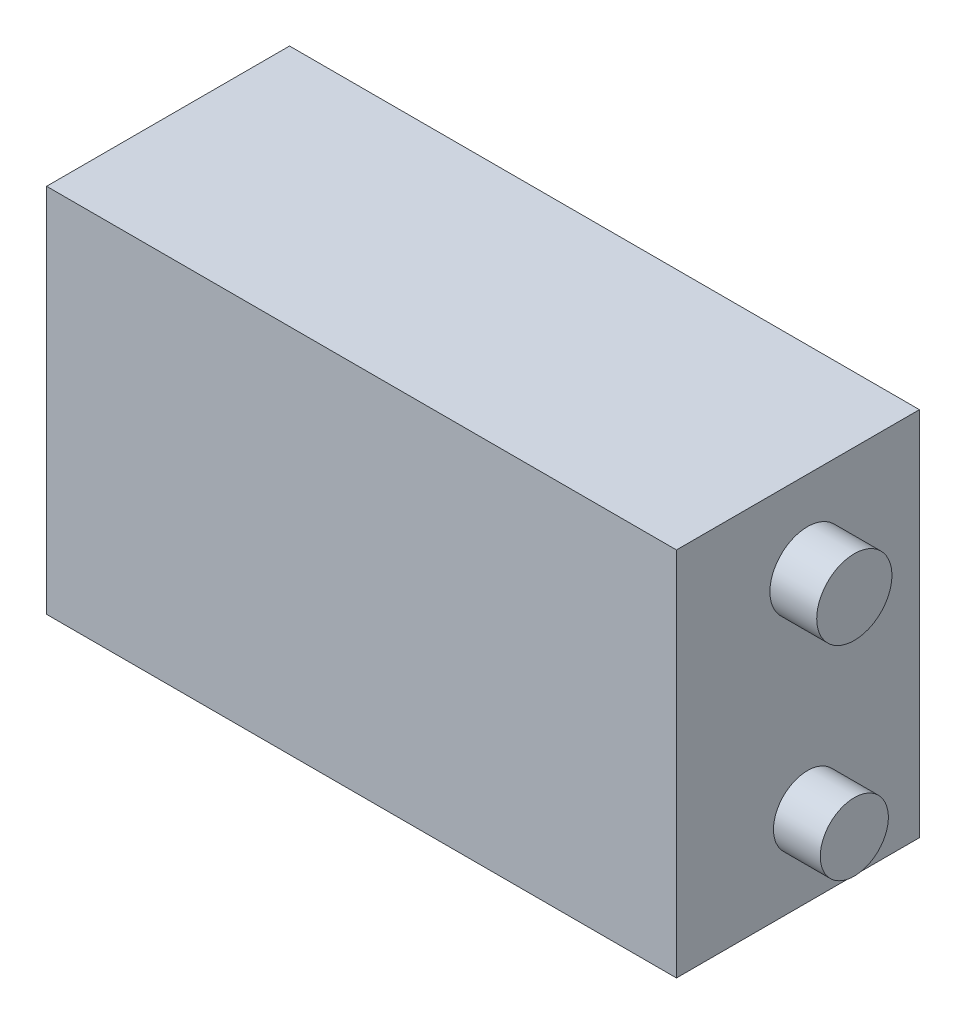
ISO-10303-21;
HEADER;
FILE_DESCRIPTION(('STEP AP214'),'2;1');
FILE_NAME('part.step','',(''),(''),'','','');
FILE_SCHEMA(('AUTOMOTIVE_DESIGN { 1 0 10303 214 1 1 1 1 }'));
ENDSEC;
DATA;
#1=APPLICATION_CONTEXT('core data for automotive mechanical design processes');
#2=APPLICATION_PROTOCOL_DEFINITION('international standard','automotive_design',2000,#1);
#3=PRODUCT_CONTEXT('',#1,'mechanical');
#4=PRODUCT('Part','Part','',(#3));
#5=PRODUCT_RELATED_PRODUCT_CATEGORY('part','',(#4));
#6=PRODUCT_DEFINITION_FORMATION('','',#4);
#7=PRODUCT_DEFINITION_CONTEXT('part definition',#1,'design');
#8=PRODUCT_DEFINITION('design','',#6,#7);
#9=PRODUCT_DEFINITION_SHAPE('','',#8);
#10=(LENGTH_UNIT() NAMED_UNIT(*) SI_UNIT(.MILLI.,.METRE.));
#11=(NAMED_UNIT(*) PLANE_ANGLE_UNIT() SI_UNIT($,.RADIAN.));
#12=(NAMED_UNIT(*) SI_UNIT($,.STERADIAN.) SOLID_ANGLE_UNIT());
#13=UNCERTAINTY_MEASURE_WITH_UNIT(LENGTH_MEASURE(1.E-05),#10,'distance_accuracy_value','');
#14=(GEOMETRIC_REPRESENTATION_CONTEXT(3) GLOBAL_UNCERTAINTY_ASSIGNED_CONTEXT((#13)) GLOBAL_UNIT_ASSIGNED_CONTEXT((#10,
#11,#12)) REPRESENTATION_CONTEXT('',''));
#15=CARTESIAN_POINT('',(0.,0.,0.));
#16=DIRECTION('',(0.,0.,1.));
#17=DIRECTION('',(1.,0.,0.));
#18=AXIS2_PLACEMENT_3D('',#15,#16,#17);
#19=CARTESIAN_POINT('',(22.225,-13.081,17.145));
#20=DIRECTION('',(-1.,0.,0.));
#21=DIRECTION('',(0.,0.,1.));
#22=AXIS2_PLACEMENT_3D('',#19,#20,#21);
#23=PLANE('',#22);
#24=CARTESIAN_POINT('',(22.225,7.2270346236758,7.89684855686801));
#25=DIRECTION('',(-1.,0.,0.));
#26=DIRECTION('',(0.,0.,1.));
#27=AXIS2_PLACEMENT_3D('',#24,#25,#26);
#28=CIRCLE('',#27,2.65301325762193);
#29=CARTESIAN_POINT('',(22.225,7.2270346236758,10.5498618144899));
#30=VERTEX_POINT('',#29);
#31=EDGE_CURVE('E41',#30,#30,#28,.F.);
#32=ORIENTED_EDGE('',*,*,#31,.F.);
#33=EDGE_LOOP('',(#32));
#34=FACE_BOUND('',#33,.T.);
#35=DIRECTION('',(0.,1.,0.));
#36=VECTOR('',#35,1.);
#37=CARTESIAN_POINT('',(22.225,-13.081,0.));
#38=LINE('',#37,#36);
#39=CARTESIAN_POINT('',(22.225,-13.081,0.));
#40=VERTEX_POINT('',#39);
#41=CARTESIAN_POINT('',(22.225,13.081,0.));
#42=VERTEX_POINT('',#41);
#43=EDGE_CURVE('E100',#40,#42,#38,.T.);
#44=ORIENTED_EDGE('',*,*,#43,.T.);
#45=DIRECTION('',(0.,0.,-1.));
#46=VECTOR('',#45,1.);
#47=CARTESIAN_POINT('',(22.225,13.081,17.145));
#48=LINE('',#47,#46);
#49=CARTESIAN_POINT('',(22.225,13.081,17.145));
#50=VERTEX_POINT('',#49);
#51=EDGE_CURVE('E91',#50,#42,#48,.T.);
#52=ORIENTED_EDGE('',*,*,#51,.F.);
#53=DIRECTION('',(0.,1.,0.));
#54=VECTOR('',#53,1.);
#55=CARTESIAN_POINT('',(22.225,-13.081,17.145));
#56=LINE('',#55,#54);
#57=CARTESIAN_POINT('',(22.225,-13.081,17.145));
#58=VERTEX_POINT('',#57);
#59=EDGE_CURVE('E85',#58,#50,#56,.T.);
#60=ORIENTED_EDGE('',*,*,#59,.F.);
#61=DIRECTION('',(0.,0.,-1.));
#62=VECTOR('',#61,1.);
#63=CARTESIAN_POINT('',(22.225,-13.081,17.145));
#64=LINE('',#63,#62);
#65=EDGE_CURVE('E96',#58,#40,#64,.T.);
#66=ORIENTED_EDGE('',*,*,#65,.T.);
#67=EDGE_LOOP('',(#44,#52,#60,#66));
#68=FACE_BOUND('',#67,.T.);
#69=CARTESIAN_POINT('',(22.225,-7.42883629189883,7.89684855686801));
#70=DIRECTION('',(-1.,0.,0.));
#71=DIRECTION('',(0.,0.,1.));
#72=AXIS2_PLACEMENT_3D('',#69,#70,#71);
#73=CIRCLE('',#72,2.4014102299792);
#74=CARTESIAN_POINT('',(22.225,-7.42883629189883,10.2982587868472));
#75=VERTEX_POINT('',#74);
#76=EDGE_CURVE('E11',#75,#75,#73,.F.);
#77=ORIENTED_EDGE('',*,*,#76,.F.);
#78=EDGE_LOOP('',(#77));
#79=FACE_BOUND('',#78,.T.);
#80=ADVANCED_FACE('F33',(#34,#68,#79),#23,.F.);
#81=CARTESIAN_POINT('',(-22.225,13.081,17.145));
#82=DIRECTION('',(0.,-1.,0.));
#83=DIRECTION('',(0.,0.,-1.));
#84=AXIS2_PLACEMENT_3D('',#81,#82,#83);
#85=PLANE('',#84);
#86=DIRECTION('',(-1.,0.,0.));
#87=VECTOR('',#86,1.);
#88=CARTESIAN_POINT('',(-22.225,13.081,0.));
#89=LINE('',#88,#87);
#90=CARTESIAN_POINT('',(-22.225,13.081,0.));
#91=VERTEX_POINT('',#90);
#92=EDGE_CURVE('E90',#42,#91,#89,.T.);
#93=ORIENTED_EDGE('',*,*,#92,.T.);
#94=DIRECTION('',(0.,0.,-1.));
#95=VECTOR('',#94,1.);
#96=CARTESIAN_POINT('',(-22.225,13.081,17.145));
#97=LINE('',#96,#95);
#98=CARTESIAN_POINT('',(-22.225,13.081,17.145));
#99=VERTEX_POINT('',#98);
#100=EDGE_CURVE('E88',#99,#91,#97,.T.);
#101=ORIENTED_EDGE('',*,*,#100,.F.);
#102=DIRECTION('',(-1.,0.,0.));
#103=VECTOR('',#102,1.);
#104=CARTESIAN_POINT('',(-22.225,13.081,17.145));
#105=LINE('',#104,#103);
#106=EDGE_CURVE('E80',#50,#99,#105,.T.);
#107=ORIENTED_EDGE('',*,*,#106,.F.);
#108=ORIENTED_EDGE('',*,*,#51,.T.);
#109=EDGE_LOOP('',(#93,#101,#107,#108));
#110=FACE_BOUND('',#109,.T.);
#111=ADVANCED_FACE('F89',(#110),#85,.F.);
#112=CARTESIAN_POINT('',(-22.225,-13.081,17.145));
#113=DIRECTION('',(1.,0.,0.));
#114=DIRECTION('',(0.,0.,-1.));
#115=AXIS2_PLACEMENT_3D('',#112,#113,#114);
#116=PLANE('',#115);
#117=DIRECTION('',(0.,-1.,0.));
#118=VECTOR('',#117,1.);
#119=CARTESIAN_POINT('',(-22.225,-13.081,0.));
#120=LINE('',#119,#118);
#121=CARTESIAN_POINT('',(-22.225,-13.081,0.));
#122=VERTEX_POINT('',#121);
#123=EDGE_CURVE('E66',#91,#122,#120,.T.);
#124=ORIENTED_EDGE('',*,*,#123,.T.);
#125=DIRECTION('',(0.,0.,-1.));
#126=VECTOR('',#125,1.);
#127=CARTESIAN_POINT('',(-22.225,-13.081,17.145));
#128=LINE('',#127,#126);
#129=CARTESIAN_POINT('',(-22.225,-13.081,17.145));
#130=VERTEX_POINT('',#129);
#131=EDGE_CURVE('E92',#130,#122,#128,.T.);
#132=ORIENTED_EDGE('',*,*,#131,.F.);
#133=DIRECTION('',(0.,-1.,0.));
#134=VECTOR('',#133,1.);
#135=CARTESIAN_POINT('',(-22.225,-13.081,17.145));
#136=LINE('',#135,#134);
#137=EDGE_CURVE('E83',#99,#130,#136,.T.);
#138=ORIENTED_EDGE('',*,*,#137,.F.);
#139=ORIENTED_EDGE('',*,*,#100,.T.);
#140=EDGE_LOOP('',(#124,#132,#138,#139));
#141=FACE_BOUND('',#140,.T.);
#142=ADVANCED_FACE('F94',(#141),#116,.F.);
#143=CARTESIAN_POINT('',(-22.225,-13.081,17.145));
#144=DIRECTION('',(0.,1.,0.));
#145=DIRECTION('',(0.,0.,1.));
#146=AXIS2_PLACEMENT_3D('',#143,#144,#145);
#147=PLANE('',#146);
#148=DIRECTION('',(1.,0.,0.));
#149=VECTOR('',#148,1.);
#150=CARTESIAN_POINT('',(-22.225,-13.081,0.));
#151=LINE('',#150,#149);
#152=EDGE_CURVE('E72',#122,#40,#151,.T.);
#153=ORIENTED_EDGE('',*,*,#152,.T.);
#154=ORIENTED_EDGE('',*,*,#65,.F.);
#155=DIRECTION('',(1.,0.,0.));
#156=VECTOR('',#155,1.);
#157=CARTESIAN_POINT('',(-22.225,-13.081,17.145));
#158=LINE('',#157,#156);
#159=EDGE_CURVE('E49',#130,#58,#158,.T.);
#160=ORIENTED_EDGE('',*,*,#159,.F.);
#161=ORIENTED_EDGE('',*,*,#131,.T.);
#162=EDGE_LOOP('',(#153,#154,#160,#161));
#163=FACE_BOUND('',#162,.T.);
#164=ADVANCED_FACE('F142',(#163),#147,.F.);
#165=CARTESIAN_POINT('',(0.,0.,17.145));
#166=DIRECTION('',(0.,0.,-1.));
#167=DIRECTION('',(-1.,0.,0.));
#168=AXIS2_PLACEMENT_3D('',#165,#166,#167);
#169=PLANE('',#168);
#170=ORIENTED_EDGE('',*,*,#59,.T.);
#171=ORIENTED_EDGE('',*,*,#106,.T.);
#172=ORIENTED_EDGE('',*,*,#137,.T.);
#173=ORIENTED_EDGE('',*,*,#159,.T.);
#174=EDGE_LOOP('',(#170,#171,#172,#173));
#175=FACE_BOUND('',#174,.T.);
#176=ADVANCED_FACE('F81',(#175),#169,.F.);
#177=CARTESIAN_POINT('',(0.,0.,0.));
#178=DIRECTION('',(0.,0.,-1.));
#179=DIRECTION('',(-1.,0.,0.));
#180=AXIS2_PLACEMENT_3D('',#177,#178,#179);
#181=PLANE('',#180);
#182=ORIENTED_EDGE('',*,*,#43,.F.);
#183=ORIENTED_EDGE('',*,*,#152,.F.);
#184=ORIENTED_EDGE('',*,*,#123,.F.);
#185=ORIENTED_EDGE('',*,*,#92,.F.);
#186=EDGE_LOOP('',(#182,#183,#184,#185));
#187=FACE_BOUND('',#186,.T.);
#188=ADVANCED_FACE('F138',(#187),#181,.T.);
#189=CARTESIAN_POINT('',(25.527,7.2270346236758,7.89684855686801));
#190=DIRECTION('',(-1.,0.,0.));
#191=DIRECTION('',(0.,0.,1.));
#192=AXIS2_PLACEMENT_3D('',#189,#190,#191);
#193=CYLINDRICAL_SURFACE('',#192,2.65301325762193);
#194=CARTESIAN_POINT('',(25.527,7.2270346236758,7.89684855686801));
#195=DIRECTION('',(1.,0.,0.));
#196=DIRECTION('',(0.,0.,-1.));
#197=AXIS2_PLACEMENT_3D('',#194,#195,#196);
#198=CIRCLE('',#197,2.65301325762193);
#199=CARTESIAN_POINT('',(25.527,7.2270346236758,10.5498618144899));
#200=VERTEX_POINT('',#199);
#201=EDGE_CURVE('E103',#200,#200,#198,.T.);
#202=CARTESIAN_POINT('',(25.527,7.2270346236758,10.5498618144899));
#203=CARTESIAN_POINT('',(25.4926041666667,7.2270346236758,10.5498618144899));
#204=CARTESIAN_POINT('',(25.4582083333333,7.2270346236758,10.5498618144899));
#205=CARTESIAN_POINT('',(25.3894166666667,7.2270346236758,10.5498618144899));
#206=CARTESIAN_POINT('',(25.3550208333333,7.2270346236758,10.5498618144899));
#207=CARTESIAN_POINT('',(25.2862291666667,7.2270346236758,10.5498618144899));
#208=CARTESIAN_POINT('',(25.2518333333333,7.2270346236758,10.5498618144899));
#209=CARTESIAN_POINT('',(25.1830416666667,7.2270346236758,10.5498618144899));
#210=CARTESIAN_POINT('',(25.1486458333333,7.2270346236758,10.5498618144899));
#211=CARTESIAN_POINT('',(25.0798541666667,7.2270346236758,10.5498618144899));
#212=CARTESIAN_POINT('',(25.0454583333333,7.2270346236758,10.5498618144899));
#213=CARTESIAN_POINT('',(24.9766666666667,7.2270346236758,10.5498618144899));
#214=CARTESIAN_POINT('',(24.9422708333333,7.2270346236758,10.5498618144899));
#215=CARTESIAN_POINT('',(24.8734791666667,7.2270346236758,10.5498618144899));
#216=CARTESIAN_POINT('',(24.8390833333333,7.2270346236758,10.5498618144899));
#217=CARTESIAN_POINT('',(24.7702916666667,7.2270346236758,10.5498618144899));
#218=CARTESIAN_POINT('',(24.7358958333333,7.2270346236758,10.5498618144899));
#219=CARTESIAN_POINT('',(24.6671041666667,7.2270346236758,10.5498618144899));
#220=CARTESIAN_POINT('',(24.6327083333333,7.2270346236758,10.5498618144899));
#221=CARTESIAN_POINT('',(24.5639166666667,7.2270346236758,10.5498618144899));
#222=CARTESIAN_POINT('',(24.5295208333333,7.2270346236758,10.5498618144899));
#223=CARTESIAN_POINT('',(24.4607291666667,7.2270346236758,10.5498618144899));
#224=CARTESIAN_POINT('',(24.4263333333333,7.2270346236758,10.5498618144899));
#225=CARTESIAN_POINT('',(24.3575416666667,7.2270346236758,10.5498618144899));
#226=CARTESIAN_POINT('',(24.3231458333333,7.2270346236758,10.5498618144899));
#227=CARTESIAN_POINT('',(24.2543541666667,7.2270346236758,10.5498618144899));
#228=CARTESIAN_POINT('',(24.2199583333333,7.2270346236758,10.5498618144899));
#229=CARTESIAN_POINT('',(24.1511666666667,7.2270346236758,10.5498618144899));
#230=CARTESIAN_POINT('',(24.1167708333333,7.2270346236758,10.5498618144899));
#231=CARTESIAN_POINT('',(24.0479791666667,7.2270346236758,10.5498618144899));
#232=CARTESIAN_POINT('',(24.0135833333333,7.2270346236758,10.5498618144899));
#233=CARTESIAN_POINT('',(23.9447916666667,7.2270346236758,10.5498618144899));
#234=CARTESIAN_POINT('',(23.9103958333333,7.2270346236758,10.5498618144899));
#235=CARTESIAN_POINT('',(23.8416041666667,7.2270346236758,10.5498618144899));
#236=CARTESIAN_POINT('',(23.8072083333333,7.2270346236758,10.5498618144899));
#237=CARTESIAN_POINT('',(23.7384166666667,7.2270346236758,10.5498618144899));
#238=CARTESIAN_POINT('',(23.7040208333333,7.2270346236758,10.5498618144899));
#239=CARTESIAN_POINT('',(23.6352291666667,7.2270346236758,10.5498618144899));
#240=CARTESIAN_POINT('',(23.6008333333333,7.2270346236758,10.5498618144899));
#241=CARTESIAN_POINT('',(23.5320416666667,7.2270346236758,10.5498618144899));
#242=CARTESIAN_POINT('',(23.4976458333333,7.2270346236758,10.5498618144899));
#243=CARTESIAN_POINT('',(23.4288541666667,7.2270346236758,10.5498618144899));
#244=CARTESIAN_POINT('',(23.3944583333333,7.2270346236758,10.5498618144899));
#245=CARTESIAN_POINT('',(23.3256666666667,7.2270346236758,10.5498618144899));
#246=CARTESIAN_POINT('',(23.2912708333333,7.2270346236758,10.5498618144899));
#247=CARTESIAN_POINT('',(23.2224791666667,7.2270346236758,10.5498618144899));
#248=CARTESIAN_POINT('',(23.1880833333333,7.2270346236758,10.5498618144899));
#249=CARTESIAN_POINT('',(23.1192916666667,7.2270346236758,10.5498618144899));
#250=CARTESIAN_POINT('',(23.0848958333333,7.2270346236758,10.5498618144899));
#251=CARTESIAN_POINT('',(23.0161041666667,7.2270346236758,10.5498618144899));
#252=CARTESIAN_POINT('',(22.9817083333333,7.2270346236758,10.5498618144899));
#253=CARTESIAN_POINT('',(22.9129166666667,7.2270346236758,10.5498618144899));
#254=CARTESIAN_POINT('',(22.8785208333333,7.2270346236758,10.5498618144899));
#255=CARTESIAN_POINT('',(22.8097291666667,7.2270346236758,10.5498618144899));
#256=CARTESIAN_POINT('',(22.7753333333333,7.2270346236758,10.5498618144899));
#257=CARTESIAN_POINT('',(22.7065416666667,7.2270346236758,10.5498618144899));
#258=CARTESIAN_POINT('',(22.6721458333333,7.2270346236758,10.5498618144899));
#259=CARTESIAN_POINT('',(22.6033541666667,7.2270346236758,10.5498618144899));
#260=CARTESIAN_POINT('',(22.5689583333333,7.2270346236758,10.5498618144899));
#261=CARTESIAN_POINT('',(22.5001666666667,7.2270346236758,10.5498618144899));
#262=CARTESIAN_POINT('',(22.4657708333333,7.2270346236758,10.5498618144899));
#263=CARTESIAN_POINT('',(22.3969791666667,7.2270346236758,10.5498618144899));
#264=CARTESIAN_POINT('',(22.3625833333333,7.2270346236758,10.5498618144899));
#265=CARTESIAN_POINT('',(22.2937916666667,7.2270346236758,10.5498618144899));
#266=CARTESIAN_POINT('',(22.2593958333333,7.2270346236758,10.5498618144899));
#267=CARTESIAN_POINT('',(22.225,7.2270346236758,10.5498618144899));
#268=B_SPLINE_CURVE_WITH_KNOTS('',3,(#202,#203,#204,#205,#206,#207,#208,#209,#210,#211,#212,
#213,#214,#215,#216,#217,#218,#219,#220,#221,#222,#223,#224,#225,#226,#227,#228,#229,#230,#231,
#232,#233,#234,#235,#236,#237,#238,#239,#240,#241,#242,#243,#244,#245,#246,#247,#248,#249,#250,
#251,#252,#253,#254,#255,#256,#257,#258,#259,#260,#261,#262,#263,#264,#265,#266,#267),
.UNSPECIFIED.,.F.,.F.,(4,2,2,2,2,2,2,2,2,2,2,2,2,2,2,2,2,2,2,2,2,2,2,2,2,2,2,2,2,2,2,2,4),(0.,
0.103187500000001,0.206375000000002,0.309562500000003,0.41275,0.515937500000001,
0.619125000000002,0.722312500000002,0.8255,0.928687500000001,1.031875,1.1350625,1.23825,
1.3414375,1.444625,1.5478125,1.651,1.7541875,1.857375,1.9605625,2.06375,2.1669375,2.270125,
2.3733125,2.4765,2.5796875,2.682875,2.7860625,2.88925,2.9924375,3.095625,3.1988125,3.302),.UNSPECIFIED.);
#269=EDGE_CURVE('BSEAM112',#200,#30,#268,.T.);
#270=ORIENTED_EDGE('',*,*,#201,.F.);
#271=ORIENTED_EDGE('',*,*,#31,.T.);
#272=ORIENTED_EDGE('',*,*,#269,.T.);
#273=ORIENTED_EDGE('',*,*,#269,.F.);
#274=EDGE_LOOP('',(#270,#272,#271,#273));
#275=FACE_BOUND('',#274,.T.);
#276=ADVANCED_FACE('F112',(#275),#193,.T.);
#277=CARTESIAN_POINT('',(25.527,7.2270346236758,7.89684855686801));
#278=DIRECTION('',(1.,0.,0.));
#279=DIRECTION('',(0.,0.,-1.));
#280=AXIS2_PLACEMENT_3D('',#277,#278,#279);
#281=PLANE('',#280);
#282=ORIENTED_EDGE('',*,*,#201,.T.);
#283=EDGE_LOOP('',(#282));
#284=FACE_BOUND('',#283,.T.);
#285=ADVANCED_FACE('F123',(#284),#281,.T.);
#286=CARTESIAN_POINT('',(25.527,-7.42883629189883,7.89684855686801));
#287=DIRECTION('',(-1.,0.,0.));
#288=DIRECTION('',(0.,0.,1.));
#289=AXIS2_PLACEMENT_3D('',#286,#287,#288);
#290=CYLINDRICAL_SURFACE('',#289,2.4014102299792);
#291=CARTESIAN_POINT('',(25.527,-7.42883629189883,7.89684855686801));
#292=DIRECTION('',(1.,0.,0.));
#293=DIRECTION('',(0.,0.,-1.));
#294=AXIS2_PLACEMENT_3D('',#291,#292,#293);
#295=CIRCLE('',#294,2.4014102299792);
#296=CARTESIAN_POINT('',(25.527,-7.42883629189883,10.2982587868472));
#297=VERTEX_POINT('',#296);
#298=EDGE_CURVE('E211',#297,#297,#295,.T.);
#299=CARTESIAN_POINT('',(25.527,-7.42883629189883,10.2982587868472));
#300=CARTESIAN_POINT('',(25.4926041666667,-7.42883629189883,10.2982587868472));
#301=CARTESIAN_POINT('',(25.4582083333333,-7.42883629189883,10.2982587868472));
#302=CARTESIAN_POINT('',(25.3894166666667,-7.42883629189883,10.2982587868472));
#303=CARTESIAN_POINT('',(25.3550208333333,-7.42883629189883,10.2982587868472));
#304=CARTESIAN_POINT('',(25.2862291666667,-7.42883629189883,10.2982587868472));
#305=CARTESIAN_POINT('',(25.2518333333333,-7.42883629189883,10.2982587868472));
#306=CARTESIAN_POINT('',(25.1830416666667,-7.42883629189883,10.2982587868472));
#307=CARTESIAN_POINT('',(25.1486458333333,-7.42883629189883,10.2982587868472));
#308=CARTESIAN_POINT('',(25.0798541666667,-7.42883629189883,10.2982587868472));
#309=CARTESIAN_POINT('',(25.0454583333333,-7.42883629189883,10.2982587868472));
#310=CARTESIAN_POINT('',(24.9766666666667,-7.42883629189883,10.2982587868472));
#311=CARTESIAN_POINT('',(24.9422708333333,-7.42883629189883,10.2982587868472));
#312=CARTESIAN_POINT('',(24.8734791666667,-7.42883629189883,10.2982587868472));
#313=CARTESIAN_POINT('',(24.8390833333333,-7.42883629189883,10.2982587868472));
#314=CARTESIAN_POINT('',(24.7702916666667,-7.42883629189883,10.2982587868472));
#315=CARTESIAN_POINT('',(24.7358958333333,-7.42883629189883,10.2982587868472));
#316=CARTESIAN_POINT('',(24.6671041666667,-7.42883629189883,10.2982587868472));
#317=CARTESIAN_POINT('',(24.6327083333333,-7.42883629189883,10.2982587868472));
#318=CARTESIAN_POINT('',(24.5639166666667,-7.42883629189883,10.2982587868472));
#319=CARTESIAN_POINT('',(24.5295208333333,-7.42883629189883,10.2982587868472));
#320=CARTESIAN_POINT('',(24.4607291666667,-7.42883629189883,10.2982587868472));
#321=CARTESIAN_POINT('',(24.4263333333333,-7.42883629189883,10.2982587868472));
#322=CARTESIAN_POINT('',(24.3575416666667,-7.42883629189883,10.2982587868472));
#323=CARTESIAN_POINT('',(24.3231458333333,-7.42883629189883,10.2982587868472));
#324=CARTESIAN_POINT('',(24.2543541666667,-7.42883629189883,10.2982587868472));
#325=CARTESIAN_POINT('',(24.2199583333333,-7.42883629189883,10.2982587868472));
#326=CARTESIAN_POINT('',(24.1511666666667,-7.42883629189883,10.2982587868472));
#327=CARTESIAN_POINT('',(24.1167708333333,-7.42883629189883,10.2982587868472));
#328=CARTESIAN_POINT('',(24.0479791666667,-7.42883629189883,10.2982587868472));
#329=CARTESIAN_POINT('',(24.0135833333333,-7.42883629189883,10.2982587868472));
#330=CARTESIAN_POINT('',(23.9447916666667,-7.42883629189883,10.2982587868472));
#331=CARTESIAN_POINT('',(23.9103958333333,-7.42883629189883,10.2982587868472));
#332=CARTESIAN_POINT('',(23.8416041666667,-7.42883629189883,10.2982587868472));
#333=CARTESIAN_POINT('',(23.8072083333333,-7.42883629189883,10.2982587868472));
#334=CARTESIAN_POINT('',(23.7384166666667,-7.42883629189883,10.2982587868472));
#335=CARTESIAN_POINT('',(23.7040208333333,-7.42883629189883,10.2982587868472));
#336=CARTESIAN_POINT('',(23.6352291666667,-7.42883629189883,10.2982587868472));
#337=CARTESIAN_POINT('',(23.6008333333333,-7.42883629189883,10.2982587868472));
#338=CARTESIAN_POINT('',(23.5320416666667,-7.42883629189883,10.2982587868472));
#339=CARTESIAN_POINT('',(23.4976458333333,-7.42883629189883,10.2982587868472));
#340=CARTESIAN_POINT('',(23.4288541666667,-7.42883629189883,10.2982587868472));
#341=CARTESIAN_POINT('',(23.3944583333333,-7.42883629189883,10.2982587868472));
#342=CARTESIAN_POINT('',(23.3256666666667,-7.42883629189883,10.2982587868472));
#343=CARTESIAN_POINT('',(23.2912708333333,-7.42883629189883,10.2982587868472));
#344=CARTESIAN_POINT('',(23.2224791666667,-7.42883629189883,10.2982587868472));
#345=CARTESIAN_POINT('',(23.1880833333333,-7.42883629189883,10.2982587868472));
#346=CARTESIAN_POINT('',(23.1192916666667,-7.42883629189883,10.2982587868472));
#347=CARTESIAN_POINT('',(23.0848958333333,-7.42883629189883,10.2982587868472));
#348=CARTESIAN_POINT('',(23.0161041666667,-7.42883629189883,10.2982587868472));
#349=CARTESIAN_POINT('',(22.9817083333333,-7.42883629189883,10.2982587868472));
#350=CARTESIAN_POINT('',(22.9129166666667,-7.42883629189883,10.2982587868472));
#351=CARTESIAN_POINT('',(22.8785208333333,-7.42883629189883,10.2982587868472));
#352=CARTESIAN_POINT('',(22.8097291666667,-7.42883629189883,10.2982587868472));
#353=CARTESIAN_POINT('',(22.7753333333333,-7.42883629189883,10.2982587868472));
#354=CARTESIAN_POINT('',(22.7065416666667,-7.42883629189883,10.2982587868472));
#355=CARTESIAN_POINT('',(22.6721458333333,-7.42883629189883,10.2982587868472));
#356=CARTESIAN_POINT('',(22.6033541666667,-7.42883629189883,10.2982587868472));
#357=CARTESIAN_POINT('',(22.5689583333333,-7.42883629189883,10.2982587868472));
#358=CARTESIAN_POINT('',(22.5001666666667,-7.42883629189883,10.2982587868472));
#359=CARTESIAN_POINT('',(22.4657708333333,-7.42883629189883,10.2982587868472));
#360=CARTESIAN_POINT('',(22.3969791666667,-7.42883629189883,10.2982587868472));
#361=CARTESIAN_POINT('',(22.3625833333333,-7.42883629189883,10.2982587868472));
#362=CARTESIAN_POINT('',(22.2937916666667,-7.42883629189883,10.2982587868472));
#363=CARTESIAN_POINT('',(22.2593958333333,-7.42883629189883,10.2982587868472));
#364=CARTESIAN_POINT('',(22.225,-7.42883629189883,10.2982587868472));
#365=B_SPLINE_CURVE_WITH_KNOTS('',3,(#299,#300,#301,#302,#303,#304,#305,#306,#307,#308,#309,
#310,#311,#312,#313,#314,#315,#316,#317,#318,#319,#320,#321,#322,#323,#324,#325,#326,#327,#328,
#329,#330,#331,#332,#333,#334,#335,#336,#337,#338,#339,#340,#341,#342,#343,#344,#345,#346,#347,
#348,#349,#350,#351,#352,#353,#354,#355,#356,#357,#358,#359,#360,#361,#362,#363,#364),
.UNSPECIFIED.,.F.,.F.,(4,2,2,2,2,2,2,2,2,2,2,2,2,2,2,2,2,2,2,2,2,2,2,2,2,2,2,2,2,2,2,2,4),(0.,
0.103187500000001,0.206375000000002,0.309562500000003,0.41275,0.515937500000001,
0.619125000000002,0.722312500000002,0.8255,0.928687500000001,1.031875,1.1350625,1.23825,
1.3414375,1.444625,1.5478125,1.651,1.7541875,1.857375,1.9605625,2.06375,2.1669375,2.270125,
2.3733125,2.4765,2.5796875,2.682875,2.7860625,2.88925,2.9924375,3.095625,3.1988125,3.302),.UNSPECIFIED.);
#366=EDGE_CURVE('BSEAM120',#297,#75,#365,.T.);
#367=ORIENTED_EDGE('',*,*,#298,.F.);
#368=ORIENTED_EDGE('',*,*,#76,.T.);
#369=ORIENTED_EDGE('',*,*,#366,.T.);
#370=ORIENTED_EDGE('',*,*,#366,.F.);
#371=EDGE_LOOP('',(#367,#369,#368,#370));
#372=FACE_BOUND('',#371,.T.);
#373=ADVANCED_FACE('F120',(#372),#290,.T.);
#374=CARTESIAN_POINT('',(25.527,-7.42883629189883,7.89684855686801));
#375=DIRECTION('',(1.,0.,0.));
#376=DIRECTION('',(0.,0.,-1.));
#377=AXIS2_PLACEMENT_3D('',#374,#375,#376);
#378=PLANE('',#377);
#379=ORIENTED_EDGE('',*,*,#298,.T.);
#380=EDGE_LOOP('',(#379));
#381=FACE_BOUND('',#380,.T.);
#382=ADVANCED_FACE('F122',(#381),#378,.T.);
#383=CLOSED_SHELL('',(#80,#111,#142,#164,#176,#188,#276,#285,#373,#382));
#384=MANIFOLD_SOLID_BREP('B2',#383);
#385=ADVANCED_BREP_SHAPE_REPRESENTATION('',(#18,#384),#14);
#386=SHAPE_DEFINITION_REPRESENTATION(#9,#385);
ENDSEC;
END-ISO-10303-21;
